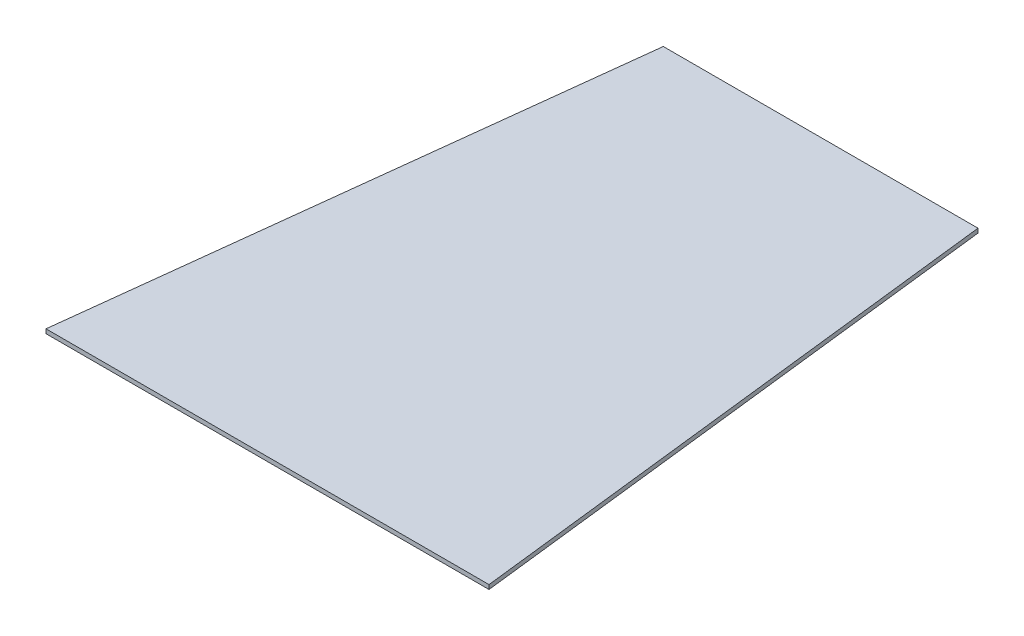
ISO-10303-21;
HEADER;
FILE_DESCRIPTION(('STEP AP214'),'2;1');
FILE_NAME('part.step','',(''),(''),'','','');
FILE_SCHEMA(('AUTOMOTIVE_DESIGN { 1 0 10303 214 1 1 1 1 }'));
ENDSEC;
DATA;
#1=APPLICATION_CONTEXT('core data for automotive mechanical design processes');
#2=APPLICATION_PROTOCOL_DEFINITION('international standard','automotive_design',2000,#1);
#3=PRODUCT_CONTEXT('',#1,'mechanical');
#4=PRODUCT('Part','Part','',(#3));
#5=PRODUCT_RELATED_PRODUCT_CATEGORY('part','',(#4));
#6=PRODUCT_DEFINITION_FORMATION('','',#4);
#7=PRODUCT_DEFINITION_CONTEXT('part definition',#1,'design');
#8=PRODUCT_DEFINITION('design','',#6,#7);
#9=PRODUCT_DEFINITION_SHAPE('','',#8);
#10=(LENGTH_UNIT() NAMED_UNIT(*) SI_UNIT(.MILLI.,.METRE.));
#11=(NAMED_UNIT(*) PLANE_ANGLE_UNIT() SI_UNIT($,.RADIAN.));
#12=(NAMED_UNIT(*) SI_UNIT($,.STERADIAN.) SOLID_ANGLE_UNIT());
#13=UNCERTAINTY_MEASURE_WITH_UNIT(LENGTH_MEASURE(1.E-05),#10,'distance_accuracy_value','');
#14=(GEOMETRIC_REPRESENTATION_CONTEXT(3) GLOBAL_UNCERTAINTY_ASSIGNED_CONTEXT((#13)) GLOBAL_UNIT_ASSIGNED_CONTEXT((#10,
#11,#12)) REPRESENTATION_CONTEXT('',''));
#15=CARTESIAN_POINT('',(0.,0.,0.));
#16=DIRECTION('',(0.,0.,1.));
#17=DIRECTION('',(1.,0.,0.));
#18=AXIS2_PLACEMENT_3D('',#15,#16,#17);
#19=CARTESIAN_POINT('',(0.,2.9972,0.));
#20=DIRECTION('',(0.,0.,1.));
#21=DIRECTION('',(1.,0.,0.));
#22=AXIS2_PLACEMENT_3D('',#19,#20,#21);
#23=PLANE('',#22);
#24=DIRECTION('',(0.,-1.,0.));
#25=VECTOR('',#24,1.);
#26=CARTESIAN_POINT('',(168.791021581377,2.9972,0.));
#27=LINE('',#26,#25);
#28=CARTESIAN_POINT('',(168.791021581377,2.9972,0.));
#29=VERTEX_POINT('',#28);
#30=CARTESIAN_POINT('',(168.791021581377,0.,0.));
#31=VERTEX_POINT('',#30);
#32=EDGE_CURVE('E91',#29,#31,#27,.T.);
#33=ORIENTED_EDGE('',*,*,#32,.F.);
#34=DIRECTION('',(-1.,0.,0.));
#35=VECTOR('',#34,1.);
#36=CARTESIAN_POINT('',(0.,2.9972,0.));
#37=LINE('',#36,#35);
#38=CARTESIAN_POINT('',(390.074075912856,2.9972,0.));
#39=VERTEX_POINT('',#38);
#40=EDGE_CURVE('E12',#39,#29,#37,.T.);
#41=ORIENTED_EDGE('',*,*,#40,.F.);
#42=DIRECTION('',(0.,-1.,0.));
#43=VECTOR('',#42,1.);
#44=CARTESIAN_POINT('',(390.074075912856,2.9972,0.));
#45=LINE('',#44,#43);
#46=CARTESIAN_POINT('',(390.074075912856,0.,0.));
#47=VERTEX_POINT('',#46);
#48=EDGE_CURVE('E71',#39,#47,#45,.T.);
#49=ORIENTED_EDGE('',*,*,#48,.T.);
#50=DIRECTION('',(-1.,0.,0.));
#51=VECTOR('',#50,1.);
#52=CARTESIAN_POINT('',(0.,0.,0.));
#53=LINE('',#52,#51);
#54=EDGE_CURVE('E36',#47,#31,#53,.T.);
#55=ORIENTED_EDGE('',*,*,#54,.T.);
#56=EDGE_LOOP('',(#33,#41,#49,#55));
#57=FACE_BOUND('',#56,.T.);
#58=ADVANCED_FACE('F33',(#57),#23,.F.);
#59=CARTESIAN_POINT('',(0.,2.9972,0.));
#60=DIRECTION('',(0.,1.,0.));
#61=DIRECTION('',(0.,0.,1.));
#62=AXIS2_PLACEMENT_3D('',#59,#60,#61);
#63=PLANE('',#62);
#64=ORIENTED_EDGE('',*,*,#40,.T.);
#65=DIRECTION('',(0.115226337497706,0.,-0.993339262863834));
#66=VECTOR('',#65,1.);
#67=CARTESIAN_POINT('',(168.791021581377,2.9972,0.));
#68=LINE('',#67,#66);
#69=CARTESIAN_POINT('',(123.672720315308,2.9972,388.954305886857));
#70=VERTEX_POINT('',#69);
#71=EDGE_CURVE('E82',#70,#29,#68,.T.);
#72=ORIENTED_EDGE('',*,*,#71,.F.);
#73=DIRECTION('',(-1.,0.,0.));
#74=VECTOR('',#73,1.);
#75=CARTESIAN_POINT('',(123.672720315308,2.9972,388.954305886857));
#76=LINE('',#75,#74);
#77=CARTESIAN_POINT('',(435.192377178924,2.9972,388.954305886857));
#78=VERTEX_POINT('',#77);
#79=EDGE_CURVE('E87',#78,#70,#76,.T.);
#80=ORIENTED_EDGE('',*,*,#79,.F.);
#81=DIRECTION('',(0.115226337497705,0.,0.993339262863834));
#82=VECTOR('',#81,1.);
#83=CARTESIAN_POINT('',(435.192377178924,2.9972,388.954305886857));
#84=LINE('',#83,#82);
#85=EDGE_CURVE('E74',#39,#78,#84,.T.);
#86=ORIENTED_EDGE('',*,*,#85,.F.);
#87=EDGE_LOOP('',(#64,#72,#80,#86));
#88=FACE_BOUND('',#87,.T.);
#89=ADVANCED_FACE('F85',(#88),#63,.T.);
#90=CARTESIAN_POINT('',(0.,0.,0.));
#91=DIRECTION('',(0.,1.,0.));
#92=DIRECTION('',(0.,0.,1.));
#93=AXIS2_PLACEMENT_3D('',#90,#91,#92);
#94=PLANE('',#93);
#95=DIRECTION('',(0.115226337497706,0.,-0.993339262863834));
#96=VECTOR('',#95,1.);
#97=CARTESIAN_POINT('',(168.791021581377,0.,0.));
#98=LINE('',#97,#96);
#99=CARTESIAN_POINT('',(123.672720315308,0.,388.954305886857));
#100=VERTEX_POINT('',#99);
#101=EDGE_CURVE('E88',#100,#31,#98,.T.);
#102=ORIENTED_EDGE('',*,*,#101,.T.);
#103=ORIENTED_EDGE('',*,*,#54,.F.);
#104=DIRECTION('',(0.115226337497705,0.,0.993339262863834));
#105=VECTOR('',#104,1.);
#106=CARTESIAN_POINT('',(435.192377178924,0.,388.954305886857));
#107=LINE('',#106,#105);
#108=CARTESIAN_POINT('',(435.192377178924,0.,388.954305886857));
#109=VERTEX_POINT('',#108);
#110=EDGE_CURVE('E77',#47,#109,#107,.T.);
#111=ORIENTED_EDGE('',*,*,#110,.T.);
#112=DIRECTION('',(-1.,0.,0.));
#113=VECTOR('',#112,1.);
#114=CARTESIAN_POINT('',(123.672720315308,0.,388.954305886857));
#115=LINE('',#114,#113);
#116=EDGE_CURVE('E47',#109,#100,#115,.T.);
#117=ORIENTED_EDGE('',*,*,#116,.T.);
#118=EDGE_LOOP('',(#102,#103,#111,#117));
#119=FACE_BOUND('',#118,.T.);
#120=ADVANCED_FACE('F102',(#119),#94,.F.);
#121=CARTESIAN_POINT('',(168.791021581377,2.9972,0.));
#122=DIRECTION('',(-0.993339262863834,0.,-0.115226337497706));
#123=DIRECTION('',(-0.115226337497706,0.,0.993339262863834));
#124=AXIS2_PLACEMENT_3D('',#121,#122,#123);
#125=PLANE('',#124);
#126=ORIENTED_EDGE('',*,*,#101,.F.);
#127=DIRECTION('',(0.,-1.,0.));
#128=VECTOR('',#127,1.);
#129=CARTESIAN_POINT('',(123.672720315308,2.9972,388.954305886857));
#130=LINE('',#129,#128);
#131=EDGE_CURVE('E95',#70,#100,#130,.T.);
#132=ORIENTED_EDGE('',*,*,#131,.F.);
#133=ORIENTED_EDGE('',*,*,#71,.T.);
#134=ORIENTED_EDGE('',*,*,#32,.T.);
#135=EDGE_LOOP('',(#126,#132,#133,#134));
#136=FACE_BOUND('',#135,.T.);
#137=ADVANCED_FACE('F107',(#136),#125,.T.);
#138=CARTESIAN_POINT('',(123.672720315308,2.9972,388.954305886857));
#139=DIRECTION('',(0.,0.,1.));
#140=DIRECTION('',(1.,0.,0.));
#141=AXIS2_PLACEMENT_3D('',#138,#139,#140);
#142=PLANE('',#141);
#143=ORIENTED_EDGE('',*,*,#116,.F.);
#144=DIRECTION('',(0.,-1.,0.));
#145=VECTOR('',#144,1.);
#146=CARTESIAN_POINT('',(435.192377178924,2.9972,388.954305886857));
#147=LINE('',#146,#145);
#148=EDGE_CURVE('E51',#78,#109,#147,.T.);
#149=ORIENTED_EDGE('',*,*,#148,.F.);
#150=ORIENTED_EDGE('',*,*,#79,.T.);
#151=ORIENTED_EDGE('',*,*,#131,.T.);
#152=EDGE_LOOP('',(#143,#149,#150,#151));
#153=FACE_BOUND('',#152,.T.);
#154=ADVANCED_FACE('F106',(#153),#142,.T.);
#155=CARTESIAN_POINT('',(435.192377178924,2.9972,388.954305886857));
#156=DIRECTION('',(0.993339262863834,0.,-0.115226337497705));
#157=DIRECTION('',(-0.115226337497705,0.,-0.993339262863834));
#158=AXIS2_PLACEMENT_3D('',#155,#156,#157);
#159=PLANE('',#158);
#160=ORIENTED_EDGE('',*,*,#110,.F.);
#161=ORIENTED_EDGE('',*,*,#48,.F.);
#162=ORIENTED_EDGE('',*,*,#85,.T.);
#163=ORIENTED_EDGE('',*,*,#148,.T.);
#164=EDGE_LOOP('',(#160,#161,#162,#163));
#165=FACE_BOUND('',#164,.T.);
#166=ADVANCED_FACE('F73',(#165),#159,.T.);
#167=CLOSED_SHELL('',(#58,#89,#120,#137,#154,#166));
#168=MANIFOLD_SOLID_BREP('B2',#167);
#169=ADVANCED_BREP_SHAPE_REPRESENTATION('',(#18,#168),#14);
#170=SHAPE_DEFINITION_REPRESENTATION(#9,#169);
ENDSEC;
END-ISO-10303-21;
